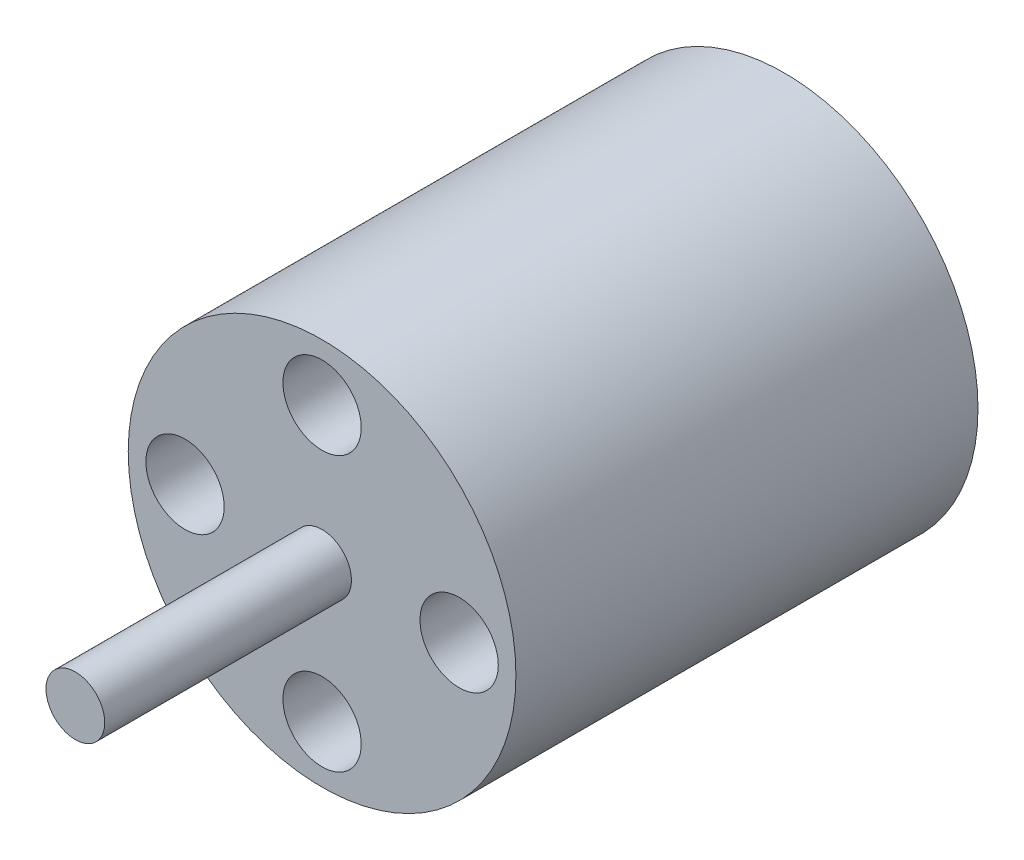
ISO-10303-21;
HEADER;
FILE_DESCRIPTION(('STEP AP214'),'2;1');
FILE_NAME('part.step','',(''),(''),'','','');
FILE_SCHEMA(('AUTOMOTIVE_DESIGN { 1 0 10303 214 1 1 1 1 }'));
ENDSEC;
DATA;
#1=APPLICATION_CONTEXT('core data for automotive mechanical design processes');
#2=APPLICATION_PROTOCOL_DEFINITION('international standard','automotive_design',2000,#1);
#3=PRODUCT_CONTEXT('',#1,'mechanical');
#4=PRODUCT('Part','Part','',(#3));
#5=PRODUCT_RELATED_PRODUCT_CATEGORY('part','',(#4));
#6=PRODUCT_DEFINITION_FORMATION('','',#4);
#7=PRODUCT_DEFINITION_CONTEXT('part definition',#1,'design');
#8=PRODUCT_DEFINITION('design','',#6,#7);
#9=PRODUCT_DEFINITION_SHAPE('','',#8);
#10=(LENGTH_UNIT() NAMED_UNIT(*) SI_UNIT(.MILLI.,.METRE.));
#11=(NAMED_UNIT(*) PLANE_ANGLE_UNIT() SI_UNIT($,.RADIAN.));
#12=(NAMED_UNIT(*) SI_UNIT($,.STERADIAN.) SOLID_ANGLE_UNIT());
#13=UNCERTAINTY_MEASURE_WITH_UNIT(LENGTH_MEASURE(1.E-05),#10,'distance_accuracy_value','');
#14=(GEOMETRIC_REPRESENTATION_CONTEXT(3) GLOBAL_UNCERTAINTY_ASSIGNED_CONTEXT((#13)) GLOBAL_UNIT_ASSIGNED_CONTEXT((#10,
#11,#12)) REPRESENTATION_CONTEXT('',''));
#15=CARTESIAN_POINT('',(0.,0.,0.));
#16=DIRECTION('',(0.,0.,1.));
#17=DIRECTION('',(1.,0.,0.));
#18=AXIS2_PLACEMENT_3D('',#15,#16,#17);
#19=CARTESIAN_POINT('',(0.,0.,11.8));
#20=DIRECTION('',(0.,0.,-1.));
#21=DIRECTION('',(-1.,0.,0.));
#22=AXIS2_PLACEMENT_3D('',#19,#20,#21);
#23=CYLINDRICAL_SURFACE('',#22,4.95);
#24=CARTESIAN_POINT('',(0.,0.,11.8));
#25=DIRECTION('',(0.,0.,1.));
#26=DIRECTION('',(1.,0.,0.));
#27=AXIS2_PLACEMENT_3D('',#24,#25,#26);
#28=CIRCLE('',#27,4.95);
#29=CARTESIAN_POINT('',(4.95,0.,11.8));
#30=VERTEX_POINT('',#29);
#31=EDGE_CURVE('E10',#30,#30,#28,.T.);
#32=ORIENTED_EDGE('',*,*,#31,.F.);
#33=EDGE_LOOP('',(#32));
#34=FACE_BOUND('',#33,.T.);
#35=CARTESIAN_POINT('',(0.,0.,0.));
#36=DIRECTION('',(0.,0.,1.));
#37=DIRECTION('',(1.,0.,0.));
#38=AXIS2_PLACEMENT_3D('',#35,#36,#37);
#39=CIRCLE('',#38,4.95);
#40=CARTESIAN_POINT('',(4.95,0.,0.));
#41=VERTEX_POINT('',#40);
#42=EDGE_CURVE('E46',#41,#41,#39,.T.);
#43=ORIENTED_EDGE('',*,*,#42,.T.);
#44=EDGE_LOOP('',(#43));
#45=FACE_BOUND('',#44,.T.);
#46=ADVANCED_FACE('F43',(#34,#45),#23,.T.);
#47=CARTESIAN_POINT('',(0.,0.,11.8));
#48=DIRECTION('',(0.,0.,1.));
#49=DIRECTION('',(1.,0.,0.));
#50=AXIS2_PLACEMENT_3D('',#47,#48,#49);
#51=PLANE('',#50);
#52=CARTESIAN_POINT('',(0.,3.5,11.8));
#53=DIRECTION('',(0.,0.,1.));
#54=DIRECTION('',(1.,0.,0.));
#55=AXIS2_PLACEMENT_3D('',#52,#53,#54);
#56=CIRCLE('',#55,1.);
#57=CARTESIAN_POINT('',(1.,3.5,11.8));
#58=VERTEX_POINT('',#57);
#59=EDGE_CURVE('E87',#58,#58,#56,.T.);
#60=ORIENTED_EDGE('',*,*,#59,.F.);
#61=EDGE_LOOP('',(#60));
#62=FACE_BOUND('',#61,.T.);
#63=CARTESIAN_POINT('',(-3.5,0.,11.8));
#64=DIRECTION('',(0.,0.,1.));
#65=DIRECTION('',(1.,0.,0.));
#66=AXIS2_PLACEMENT_3D('',#63,#64,#65);
#67=CIRCLE('',#66,1.);
#68=CARTESIAN_POINT('',(-2.5,0.,11.8));
#69=VERTEX_POINT('',#68);
#70=EDGE_CURVE('E79',#69,#69,#67,.T.);
#71=ORIENTED_EDGE('',*,*,#70,.F.);
#72=EDGE_LOOP('',(#71));
#73=FACE_BOUND('',#72,.T.);
#74=CARTESIAN_POINT('',(3.5,0.,11.8));
#75=DIRECTION('',(0.,0.,1.));
#76=DIRECTION('',(1.,0.,0.));
#77=AXIS2_PLACEMENT_3D('',#74,#75,#76);
#78=CIRCLE('',#77,1.);
#79=CARTESIAN_POINT('',(4.5,0.,11.8));
#80=VERTEX_POINT('',#79);
#81=EDGE_CURVE('E71',#80,#80,#78,.T.);
#82=ORIENTED_EDGE('',*,*,#81,.F.);
#83=EDGE_LOOP('',(#82));
#84=FACE_BOUND('',#83,.T.);
#85=CARTESIAN_POINT('',(0.,-3.5,11.8));
#86=DIRECTION('',(0.,0.,1.));
#87=DIRECTION('',(1.,0.,0.));
#88=AXIS2_PLACEMENT_3D('',#85,#86,#87);
#89=CIRCLE('',#88,1.);
#90=CARTESIAN_POINT('',(0.999999999999976,-3.5,11.8));
#91=VERTEX_POINT('',#90);
#92=EDGE_CURVE('E63',#91,#91,#89,.T.);
#93=ORIENTED_EDGE('',*,*,#92,.F.);
#94=EDGE_LOOP('',(#93));
#95=FACE_BOUND('',#94,.T.);
#96=CARTESIAN_POINT('',(0.,0.,11.8));
#97=DIRECTION('',(0.,0.,1.));
#98=DIRECTION('',(1.,0.,0.));
#99=AXIS2_PLACEMENT_3D('',#96,#97,#98);
#100=CIRCLE('',#99,0.75);
#101=CARTESIAN_POINT('',(-0.75,0.,11.8));
#102=VERTEX_POINT('',#101);
#103=EDGE_CURVE('E51',#102,#102,#100,.T.);
#104=ORIENTED_EDGE('',*,*,#103,.F.);
#105=EDGE_LOOP('',(#104));
#106=FACE_BOUND('',#105,.T.);
#107=ORIENTED_EDGE('',*,*,#31,.T.);
#108=EDGE_LOOP('',(#107));
#109=FACE_BOUND('',#108,.T.);
#110=ADVANCED_FACE('F104',(#62,#73,#84,#95,#106,#109),#51,.T.);
#111=CARTESIAN_POINT('',(0.,0.,0.));
#112=DIRECTION('',(0.,0.,1.));
#113=DIRECTION('',(1.,0.,0.));
#114=AXIS2_PLACEMENT_3D('',#111,#112,#113);
#115=PLANE('',#114);
#116=ORIENTED_EDGE('',*,*,#42,.F.);
#117=EDGE_LOOP('',(#116));
#118=FACE_BOUND('',#117,.T.);
#119=ADVANCED_FACE('F107',(#118),#115,.F.);
#120=CARTESIAN_POINT('',(0.,0.,18.1));
#121=DIRECTION('',(0.,0.,-1.));
#122=DIRECTION('',(-1.,0.,0.));
#123=AXIS2_PLACEMENT_3D('',#120,#121,#122);
#124=CYLINDRICAL_SURFACE('',#123,0.75);
#125=CARTESIAN_POINT('',(0.,0.,18.1));
#126=DIRECTION('',(0.,0.,1.));
#127=DIRECTION('',(1.,0.,0.));
#128=AXIS2_PLACEMENT_3D('',#125,#126,#127);
#129=CIRCLE('',#128,0.75);
#130=CARTESIAN_POINT('',(-0.75,0.,18.1));
#131=VERTEX_POINT('',#130);
#132=EDGE_CURVE('E58',#131,#131,#129,.T.);
#133=CARTESIAN_POINT('',(-0.75,0.,11.8));
#134=CARTESIAN_POINT('',(-0.75,0.,11.865625));
#135=CARTESIAN_POINT('',(-0.75,0.,11.93125));
#136=CARTESIAN_POINT('',(-0.75,0.,12.0625));
#137=CARTESIAN_POINT('',(-0.75,0.,12.128125));
#138=CARTESIAN_POINT('',(-0.75,0.,12.259375));
#139=CARTESIAN_POINT('',(-0.75,0.,12.325));
#140=CARTESIAN_POINT('',(-0.75,0.,12.45625));
#141=CARTESIAN_POINT('',(-0.75,0.,12.521875));
#142=CARTESIAN_POINT('',(-0.75,0.,12.653125));
#143=CARTESIAN_POINT('',(-0.75,0.,12.71875));
#144=CARTESIAN_POINT('',(-0.75,0.,12.85));
#145=CARTESIAN_POINT('',(-0.75,0.,12.915625));
#146=CARTESIAN_POINT('',(-0.75,0.,13.046875));
#147=CARTESIAN_POINT('',(-0.75,0.,13.1125));
#148=CARTESIAN_POINT('',(-0.75,0.,13.24375));
#149=CARTESIAN_POINT('',(-0.75,0.,13.309375));
#150=CARTESIAN_POINT('',(-0.75,0.,13.440625));
#151=CARTESIAN_POINT('',(-0.75,0.,13.50625));
#152=CARTESIAN_POINT('',(-0.75,0.,13.6375));
#153=CARTESIAN_POINT('',(-0.75,0.,13.703125));
#154=CARTESIAN_POINT('',(-0.75,0.,13.834375));
#155=CARTESIAN_POINT('',(-0.75,0.,13.9));
#156=CARTESIAN_POINT('',(-0.75,0.,14.03125));
#157=CARTESIAN_POINT('',(-0.75,0.,14.096875));
#158=CARTESIAN_POINT('',(-0.75,0.,14.228125));
#159=CARTESIAN_POINT('',(-0.75,0.,14.29375));
#160=CARTESIAN_POINT('',(-0.75,0.,14.425));
#161=CARTESIAN_POINT('',(-0.75,0.,14.490625));
#162=CARTESIAN_POINT('',(-0.75,0.,14.621875));
#163=CARTESIAN_POINT('',(-0.75,0.,14.6875));
#164=CARTESIAN_POINT('',(-0.75,0.,14.81875));
#165=CARTESIAN_POINT('',(-0.75,0.,14.884375));
#166=CARTESIAN_POINT('',(-0.75,0.,15.015625));
#167=CARTESIAN_POINT('',(-0.75,0.,15.08125));
#168=CARTESIAN_POINT('',(-0.75,0.,15.2125));
#169=CARTESIAN_POINT('',(-0.75,0.,15.278125));
#170=CARTESIAN_POINT('',(-0.75,0.,15.409375));
#171=CARTESIAN_POINT('',(-0.75,0.,15.475));
#172=CARTESIAN_POINT('',(-0.75,0.,15.60625));
#173=CARTESIAN_POINT('',(-0.75,0.,15.671875));
#174=CARTESIAN_POINT('',(-0.75,0.,15.803125));
#175=CARTESIAN_POINT('',(-0.75,0.,15.86875));
#176=CARTESIAN_POINT('',(-0.75,0.,16.));
#177=CARTESIAN_POINT('',(-0.75,0.,16.065625));
#178=CARTESIAN_POINT('',(-0.75,0.,16.196875));
#179=CARTESIAN_POINT('',(-0.75,0.,16.2625));
#180=CARTESIAN_POINT('',(-0.75,0.,16.39375));
#181=CARTESIAN_POINT('',(-0.75,0.,16.459375));
#182=CARTESIAN_POINT('',(-0.75,0.,16.590625));
#183=CARTESIAN_POINT('',(-0.75,0.,16.65625));
#184=CARTESIAN_POINT('',(-0.75,0.,16.7875));
#185=CARTESIAN_POINT('',(-0.75,0.,16.853125));
#186=CARTESIAN_POINT('',(-0.75,0.,16.984375));
#187=CARTESIAN_POINT('',(-0.75,0.,17.05));
#188=CARTESIAN_POINT('',(-0.75,0.,17.18125));
#189=CARTESIAN_POINT('',(-0.75,0.,17.246875));
#190=CARTESIAN_POINT('',(-0.75,0.,17.378125));
#191=CARTESIAN_POINT('',(-0.75,0.,17.44375));
#192=CARTESIAN_POINT('',(-0.75,0.,17.575));
#193=CARTESIAN_POINT('',(-0.75,0.,17.640625));
#194=CARTESIAN_POINT('',(-0.75,0.,17.771875));
#195=CARTESIAN_POINT('',(-0.75,0.,17.8375));
#196=CARTESIAN_POINT('',(-0.75,0.,17.96875));
#197=CARTESIAN_POINT('',(-0.75,0.,18.034375));
#198=CARTESIAN_POINT('',(-0.75,0.,18.1));
#199=B_SPLINE_CURVE_WITH_KNOTS('',3,(#133,#134,#135,#136,#137,#138,#139,#140,#141,#142,#143,
#144,#145,#146,#147,#148,#149,#150,#151,#152,#153,#154,#155,#156,#157,#158,#159,#160,#161,#162,
#163,#164,#165,#166,#167,#168,#169,#170,#171,#172,#173,#174,#175,#176,#177,#178,#179,#180,#181,
#182,#183,#184,#185,#186,#187,#188,#189,#190,#191,#192,#193,#194,#195,#196,#197,#198),
.UNSPECIFIED.,.F.,.F.,(4,2,2,2,2,2,2,2,2,2,2,2,2,2,2,2,2,2,2,2,2,2,2,2,2,2,2,2,2,2,2,2,4),(0.,
0.196874999999999,0.393749999999998,0.590624999999999,0.7875,0.984374999999999,1.18125,1.378125,
1.575,1.771875,1.96875,2.165625,2.3625,2.559375,2.75625,2.953125,3.15,3.346875,3.54375,3.740625,
3.9375,4.134375,4.33125,4.528125,4.725,4.921875,5.11875,5.315625,5.5125,5.709375,5.90625,
6.103125,6.3),.UNSPECIFIED.);
#200=EDGE_CURVE('BSEAM117',#102,#131,#199,.T.);
#201=ORIENTED_EDGE('',*,*,#103,.T.);
#202=ORIENTED_EDGE('',*,*,#132,.F.);
#203=ORIENTED_EDGE('',*,*,#200,.T.);
#204=ORIENTED_EDGE('',*,*,#200,.F.);
#205=EDGE_LOOP('',(#201,#203,#202,#204));
#206=FACE_BOUND('',#205,.T.);
#207=ADVANCED_FACE('F117',(#206),#124,.T.);
#208=CARTESIAN_POINT('',(0.,0.,18.1));
#209=DIRECTION('',(0.,0.,1.));
#210=DIRECTION('',(1.,0.,0.));
#211=AXIS2_PLACEMENT_3D('',#208,#209,#210);
#212=PLANE('',#211);
#213=ORIENTED_EDGE('',*,*,#132,.T.);
#214=EDGE_LOOP('',(#213));
#215=FACE_BOUND('',#214,.T.);
#216=ADVANCED_FACE('F120',(#215),#212,.T.);
#217=CARTESIAN_POINT('',(0.,-3.5,9.8));
#218=DIRECTION('',(0.,0.,1.));
#219=DIRECTION('',(1.,0.,0.));
#220=AXIS2_PLACEMENT_3D('',#217,#218,#219);
#221=CYLINDRICAL_SURFACE('',#220,1.);
#222=CARTESIAN_POINT('',(0.,-3.5,9.8));
#223=DIRECTION('',(0.,0.,1.));
#224=DIRECTION('',(1.,0.,0.));
#225=AXIS2_PLACEMENT_3D('',#222,#223,#224);
#226=CIRCLE('',#225,1.);
#227=CARTESIAN_POINT('',(0.999999999999976,-3.5,9.8));
#228=VERTEX_POINT('',#227);
#229=EDGE_CURVE('E67',#228,#228,#226,.T.);
#230=ORIENTED_EDGE('',*,*,#229,.F.);
#231=EDGE_LOOP('',(#230));
#232=FACE_BOUND('',#231,.T.);
#233=ORIENTED_EDGE('',*,*,#92,.T.);
#234=EDGE_LOOP('',(#233));
#235=FACE_BOUND('',#234,.T.);
#236=ADVANCED_FACE('F125',(#232,#235),#221,.F.);
#237=CARTESIAN_POINT('',(0.,-3.5,9.8));
#238=DIRECTION('',(0.,0.,1.));
#239=DIRECTION('',(1.,0.,0.));
#240=AXIS2_PLACEMENT_3D('',#237,#238,#239);
#241=PLANE('',#240);
#242=ORIENTED_EDGE('',*,*,#229,.T.);
#243=EDGE_LOOP('',(#242));
#244=FACE_BOUND('',#243,.T.);
#245=ADVANCED_FACE('F130',(#244),#241,.T.);
#246=CARTESIAN_POINT('',(3.5,0.,9.8));
#247=DIRECTION('',(0.,0.,1.));
#248=DIRECTION('',(1.,0.,0.));
#249=AXIS2_PLACEMENT_3D('',#246,#247,#248);
#250=CYLINDRICAL_SURFACE('',#249,1.);
#251=CARTESIAN_POINT('',(3.5,0.,9.8));
#252=DIRECTION('',(0.,0.,1.));
#253=DIRECTION('',(1.,0.,0.));
#254=AXIS2_PLACEMENT_3D('',#251,#252,#253);
#255=CIRCLE('',#254,1.);
#256=CARTESIAN_POINT('',(4.5,0.,9.8));
#257=VERTEX_POINT('',#256);
#258=EDGE_CURVE('E75',#257,#257,#255,.T.);
#259=ORIENTED_EDGE('',*,*,#258,.F.);
#260=EDGE_LOOP('',(#259));
#261=FACE_BOUND('',#260,.T.);
#262=ORIENTED_EDGE('',*,*,#81,.T.);
#263=EDGE_LOOP('',(#262));
#264=FACE_BOUND('',#263,.T.);
#265=ADVANCED_FACE('F180',(#261,#264),#250,.F.);
#266=CARTESIAN_POINT('',(3.5,0.,9.8));
#267=DIRECTION('',(0.,0.,1.));
#268=DIRECTION('',(1.,0.,0.));
#269=AXIS2_PLACEMENT_3D('',#266,#267,#268);
#270=PLANE('',#269);
#271=ORIENTED_EDGE('',*,*,#258,.T.);
#272=EDGE_LOOP('',(#271));
#273=FACE_BOUND('',#272,.T.);
#274=ADVANCED_FACE('F191',(#273),#270,.T.);
#275=CARTESIAN_POINT('',(-3.5,0.,9.8));
#276=DIRECTION('',(0.,0.,1.));
#277=DIRECTION('',(1.,0.,0.));
#278=AXIS2_PLACEMENT_3D('',#275,#276,#277);
#279=CYLINDRICAL_SURFACE('',#278,1.);
#280=CARTESIAN_POINT('',(-3.5,0.,9.8));
#281=DIRECTION('',(0.,0.,1.));
#282=DIRECTION('',(1.,0.,0.));
#283=AXIS2_PLACEMENT_3D('',#280,#281,#282);
#284=CIRCLE('',#283,1.);
#285=CARTESIAN_POINT('',(-2.5,0.,9.8));
#286=VERTEX_POINT('',#285);
#287=EDGE_CURVE('E83',#286,#286,#284,.T.);
#288=ORIENTED_EDGE('',*,*,#287,.F.);
#289=EDGE_LOOP('',(#288));
#290=FACE_BOUND('',#289,.T.);
#291=ORIENTED_EDGE('',*,*,#70,.T.);
#292=EDGE_LOOP('',(#291));
#293=FACE_BOUND('',#292,.T.);
#294=ADVANCED_FACE('F202',(#290,#293),#279,.F.);
#295=CARTESIAN_POINT('',(-3.5,0.,9.8));
#296=DIRECTION('',(0.,0.,1.));
#297=DIRECTION('',(1.,0.,0.));
#298=AXIS2_PLACEMENT_3D('',#295,#296,#297);
#299=PLANE('',#298);
#300=ORIENTED_EDGE('',*,*,#287,.T.);
#301=EDGE_LOOP('',(#300));
#302=FACE_BOUND('',#301,.T.);
#303=ADVANCED_FACE('F100',(#302),#299,.T.);
#304=CARTESIAN_POINT('',(0.,3.5,9.8));
#305=DIRECTION('',(0.,0.,1.));
#306=DIRECTION('',(1.,0.,0.));
#307=AXIS2_PLACEMENT_3D('',#304,#305,#306);
#308=CYLINDRICAL_SURFACE('',#307,1.);
#309=CARTESIAN_POINT('',(0.,3.5,9.8));
#310=DIRECTION('',(0.,0.,1.));
#311=DIRECTION('',(1.,0.,0.));
#312=AXIS2_PLACEMENT_3D('',#309,#310,#311);
#313=CIRCLE('',#312,1.);
#314=CARTESIAN_POINT('',(1.,3.5,9.8));
#315=VERTEX_POINT('',#314);
#316=EDGE_CURVE('E62',#315,#315,#313,.T.);
#317=ORIENTED_EDGE('',*,*,#316,.F.);
#318=EDGE_LOOP('',(#317));
#319=FACE_BOUND('',#318,.T.);
#320=ORIENTED_EDGE('',*,*,#59,.T.);
#321=EDGE_LOOP('',(#320));
#322=FACE_BOUND('',#321,.T.);
#323=ADVANCED_FACE('F97',(#319,#322),#308,.F.);
#324=CARTESIAN_POINT('',(0.,3.5,9.8));
#325=DIRECTION('',(0.,0.,1.));
#326=DIRECTION('',(1.,0.,0.));
#327=AXIS2_PLACEMENT_3D('',#324,#325,#326);
#328=PLANE('',#327);
#329=ORIENTED_EDGE('',*,*,#316,.T.);
#330=EDGE_LOOP('',(#329));
#331=FACE_BOUND('',#330,.T.);
#332=ADVANCED_FACE('F95',(#331),#328,.T.);
#333=CLOSED_SHELL('',(#46,#110,#119,#207,#216,#236,#245,#265,#274,#294,#303,#323,#332));
#334=MANIFOLD_SOLID_BREP('B2',#333);
#335=ADVANCED_BREP_SHAPE_REPRESENTATION('',(#18,#334),#14);
#336=SHAPE_DEFINITION_REPRESENTATION(#9,#335);
ENDSEC;
END-ISO-10303-21;
